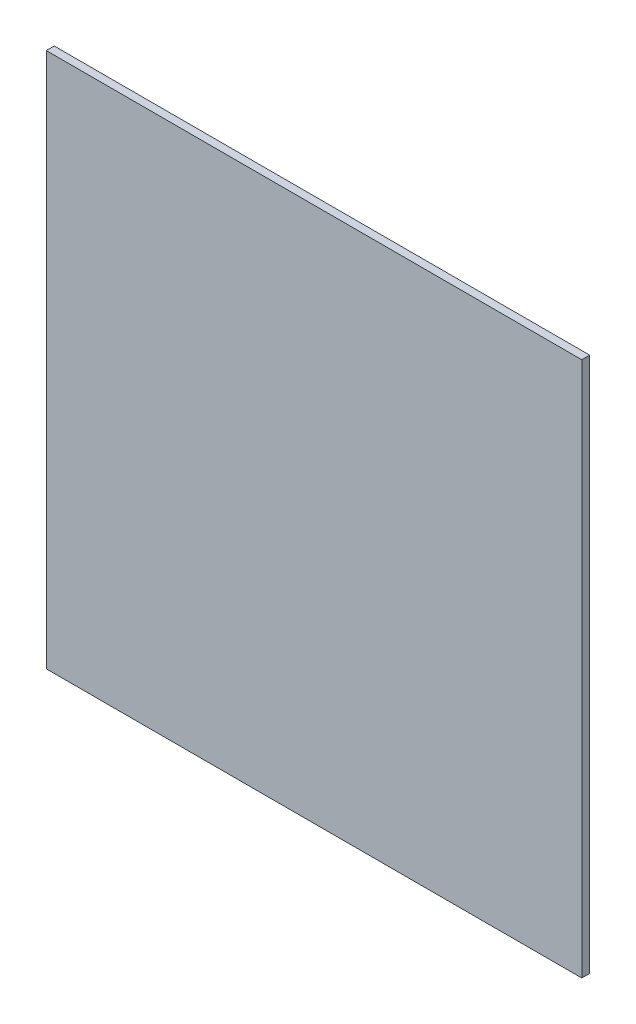
ISO-10303-21;
HEADER;
FILE_DESCRIPTION(('STEP AP214'),'2;1');
FILE_NAME('part.step','',(''),(''),'','','');
FILE_SCHEMA(('AUTOMOTIVE_DESIGN { 1 0 10303 214 1 1 1 1 }'));
ENDSEC;
DATA;
#1=APPLICATION_CONTEXT('core data for automotive mechanical design processes');
#2=APPLICATION_PROTOCOL_DEFINITION('international standard','automotive_design',2000,#1);
#3=PRODUCT_CONTEXT('',#1,'mechanical');
#4=PRODUCT('Part','Part','',(#3));
#5=PRODUCT_RELATED_PRODUCT_CATEGORY('part','',(#4));
#6=PRODUCT_DEFINITION_FORMATION('','',#4);
#7=PRODUCT_DEFINITION_CONTEXT('part definition',#1,'design');
#8=PRODUCT_DEFINITION('design','',#6,#7);
#9=PRODUCT_DEFINITION_SHAPE('','',#8);
#10=(LENGTH_UNIT() NAMED_UNIT(*) SI_UNIT(.MILLI.,.METRE.));
#11=(NAMED_UNIT(*) PLANE_ANGLE_UNIT() SI_UNIT($,.RADIAN.));
#12=(NAMED_UNIT(*) SI_UNIT($,.STERADIAN.) SOLID_ANGLE_UNIT());
#13=UNCERTAINTY_MEASURE_WITH_UNIT(LENGTH_MEASURE(1.E-05),#10,'distance_accuracy_value','');
#14=(GEOMETRIC_REPRESENTATION_CONTEXT(3) GLOBAL_UNCERTAINTY_ASSIGNED_CONTEXT((#13)) GLOBAL_UNIT_ASSIGNED_CONTEXT((#10,
#11,#12)) REPRESENTATION_CONTEXT('',''));
#15=CARTESIAN_POINT('',(0.,0.,0.));
#16=DIRECTION('',(0.,0.,1.));
#17=DIRECTION('',(1.,0.,0.));
#18=AXIS2_PLACEMENT_3D('',#15,#16,#17);
#19=CARTESIAN_POINT('',(0.,0.,0.4));
#20=DIRECTION('',(1.,0.,0.));
#21=DIRECTION('',(0.,0.,-1.));
#22=AXIS2_PLACEMENT_3D('',#19,#20,#21);
#23=PLANE('',#22);
#24=DIRECTION('',(0.,-1.,0.));
#25=VECTOR('',#24,1.);
#26=CARTESIAN_POINT('',(0.,0.,0.));
#27=LINE('',#26,#25);
#28=CARTESIAN_POINT('',(0.,27.,0.));
#29=VERTEX_POINT('',#28);
#30=CARTESIAN_POINT('',(0.,0.,0.));
#31=VERTEX_POINT('',#30);
#32=EDGE_CURVE('E108',#29,#31,#27,.T.);
#33=ORIENTED_EDGE('',*,*,#32,.T.);
#34=DIRECTION('',(0.,0.,-1.));
#35=VECTOR('',#34,1.);
#36=CARTESIAN_POINT('',(0.,0.,0.4));
#37=LINE('',#36,#35);
#38=CARTESIAN_POINT('',(0.,0.,0.4));
#39=VERTEX_POINT('',#38);
#40=EDGE_CURVE('E11',#39,#31,#37,.T.);
#41=ORIENTED_EDGE('',*,*,#40,.F.);
#42=DIRECTION('',(0.,-1.,0.));
#43=VECTOR('',#42,1.);
#44=CARTESIAN_POINT('',(0.,0.,0.4));
#45=LINE('',#44,#43);
#46=CARTESIAN_POINT('',(0.,27.,0.4));
#47=VERTEX_POINT('',#46);
#48=EDGE_CURVE('E92',#47,#39,#45,.T.);
#49=ORIENTED_EDGE('',*,*,#48,.F.);
#50=DIRECTION('',(0.,0.,-1.));
#51=VECTOR('',#50,1.);
#52=CARTESIAN_POINT('',(0.,27.,0.4));
#53=LINE('',#52,#51);
#54=EDGE_CURVE('E105',#47,#29,#53,.T.);
#55=ORIENTED_EDGE('',*,*,#54,.T.);
#56=EDGE_LOOP('',(#33,#41,#49,#55));
#57=FACE_BOUND('',#56,.T.);
#58=ADVANCED_FACE('F43',(#57),#23,.F.);
#59=CARTESIAN_POINT('',(0.,0.,0.4));
#60=DIRECTION('',(0.,1.,0.));
#61=DIRECTION('',(0.,0.,1.));
#62=AXIS2_PLACEMENT_3D('',#59,#60,#61);
#63=PLANE('',#62);
#64=DIRECTION('',(1.,0.,0.));
#65=VECTOR('',#64,1.);
#66=CARTESIAN_POINT('',(0.,0.,0.));
#67=LINE('',#66,#65);
#68=CARTESIAN_POINT('',(27.,0.,0.));
#69=VERTEX_POINT('',#68);
#70=EDGE_CURVE('E97',#31,#69,#67,.T.);
#71=ORIENTED_EDGE('',*,*,#70,.T.);
#72=DIRECTION('',(0.,0.,-1.));
#73=VECTOR('',#72,1.);
#74=CARTESIAN_POINT('',(27.,0.,0.4));
#75=LINE('',#74,#73);
#76=CARTESIAN_POINT('',(27.,0.,0.4));
#77=VERTEX_POINT('',#76);
#78=EDGE_CURVE('E51',#77,#69,#75,.T.);
#79=ORIENTED_EDGE('',*,*,#78,.F.);
#80=DIRECTION('',(1.,0.,0.));
#81=VECTOR('',#80,1.);
#82=CARTESIAN_POINT('',(0.,0.,0.4));
#83=LINE('',#82,#81);
#84=EDGE_CURVE('E87',#39,#77,#83,.T.);
#85=ORIENTED_EDGE('',*,*,#84,.F.);
#86=ORIENTED_EDGE('',*,*,#40,.T.);
#87=EDGE_LOOP('',(#71,#79,#85,#86));
#88=FACE_BOUND('',#87,.T.);
#89=ADVANCED_FACE('F100',(#88),#63,.F.);
#90=CARTESIAN_POINT('',(27.,0.,0.4));
#91=DIRECTION('',(-1.,0.,0.));
#92=DIRECTION('',(0.,0.,1.));
#93=AXIS2_PLACEMENT_3D('',#90,#91,#92);
#94=PLANE('',#93);
#95=DIRECTION('',(0.,1.,0.));
#96=VECTOR('',#95,1.);
#97=CARTESIAN_POINT('',(27.,0.,0.));
#98=LINE('',#97,#96);
#99=CARTESIAN_POINT('',(27.,27.,0.));
#100=VERTEX_POINT('',#99);
#101=EDGE_CURVE('E78',#69,#100,#98,.T.);
#102=ORIENTED_EDGE('',*,*,#101,.T.);
#103=DIRECTION('',(0.,0.,-1.));
#104=VECTOR('',#103,1.);
#105=CARTESIAN_POINT('',(27.,27.,0.4));
#106=LINE('',#105,#104);
#107=CARTESIAN_POINT('',(27.,27.,0.4));
#108=VERTEX_POINT('',#107);
#109=EDGE_CURVE('E98',#108,#100,#106,.T.);
#110=ORIENTED_EDGE('',*,*,#109,.F.);
#111=DIRECTION('',(0.,1.,0.));
#112=VECTOR('',#111,1.);
#113=CARTESIAN_POINT('',(27.,0.,0.4));
#114=LINE('',#113,#112);
#115=EDGE_CURVE('E95',#77,#108,#114,.T.);
#116=ORIENTED_EDGE('',*,*,#115,.F.);
#117=ORIENTED_EDGE('',*,*,#78,.T.);
#118=EDGE_LOOP('',(#102,#110,#116,#117));
#119=FACE_BOUND('',#118,.T.);
#120=ADVANCED_FACE('F99',(#119),#94,.F.);
#121=CARTESIAN_POINT('',(0.,27.,0.4));
#122=DIRECTION('',(0.,-1.,0.));
#123=DIRECTION('',(0.,0.,-1.));
#124=AXIS2_PLACEMENT_3D('',#121,#122,#123);
#125=PLANE('',#124);
#126=DIRECTION('',(-1.,0.,0.));
#127=VECTOR('',#126,1.);
#128=CARTESIAN_POINT('',(0.,27.,0.));
#129=LINE('',#128,#127);
#130=EDGE_CURVE('E85',#100,#29,#129,.T.);
#131=ORIENTED_EDGE('',*,*,#130,.T.);
#132=ORIENTED_EDGE('',*,*,#54,.F.);
#133=DIRECTION('',(-1.,0.,0.));
#134=VECTOR('',#133,1.);
#135=CARTESIAN_POINT('',(0.,27.,0.4));
#136=LINE('',#135,#134);
#137=EDGE_CURVE('E56',#108,#47,#136,.T.);
#138=ORIENTED_EDGE('',*,*,#137,.F.);
#139=ORIENTED_EDGE('',*,*,#109,.T.);
#140=EDGE_LOOP('',(#131,#132,#138,#139));
#141=FACE_BOUND('',#140,.T.);
#142=ADVANCED_FACE('F111',(#141),#125,.F.);
#143=CARTESIAN_POINT('',(0.,0.,0.4));
#144=DIRECTION('',(0.,0.,-1.));
#145=DIRECTION('',(-1.,0.,0.));
#146=AXIS2_PLACEMENT_3D('',#143,#144,#145);
#147=PLANE('',#146);
#148=ORIENTED_EDGE('',*,*,#48,.T.);
#149=ORIENTED_EDGE('',*,*,#84,.T.);
#150=ORIENTED_EDGE('',*,*,#115,.T.);
#151=ORIENTED_EDGE('',*,*,#137,.T.);
#152=EDGE_LOOP('',(#148,#149,#150,#151));
#153=FACE_BOUND('',#152,.T.);
#154=ADVANCED_FACE('F89',(#153),#147,.F.);
#155=CARTESIAN_POINT('',(0.,0.,0.));
#156=DIRECTION('',(0.,0.,-1.));
#157=DIRECTION('',(-1.,0.,0.));
#158=AXIS2_PLACEMENT_3D('',#155,#156,#157);
#159=PLANE('',#158);
#160=ORIENTED_EDGE('',*,*,#32,.F.);
#161=ORIENTED_EDGE('',*,*,#130,.F.);
#162=ORIENTED_EDGE('',*,*,#101,.F.);
#163=ORIENTED_EDGE('',*,*,#70,.F.);
#164=EDGE_LOOP('',(#160,#161,#162,#163));
#165=FACE_BOUND('',#164,.T.);
#166=ADVANCED_FACE('F116',(#165),#159,.T.);
#167=CLOSED_SHELL('',(#58,#89,#120,#142,#154,#166));
#168=MANIFOLD_SOLID_BREP('B2',#167);
#169=ADVANCED_BREP_SHAPE_REPRESENTATION('',(#18,#168),#14);
#170=SHAPE_DEFINITION_REPRESENTATION(#9,#169);
ENDSEC;
END-ISO-10303-21;
